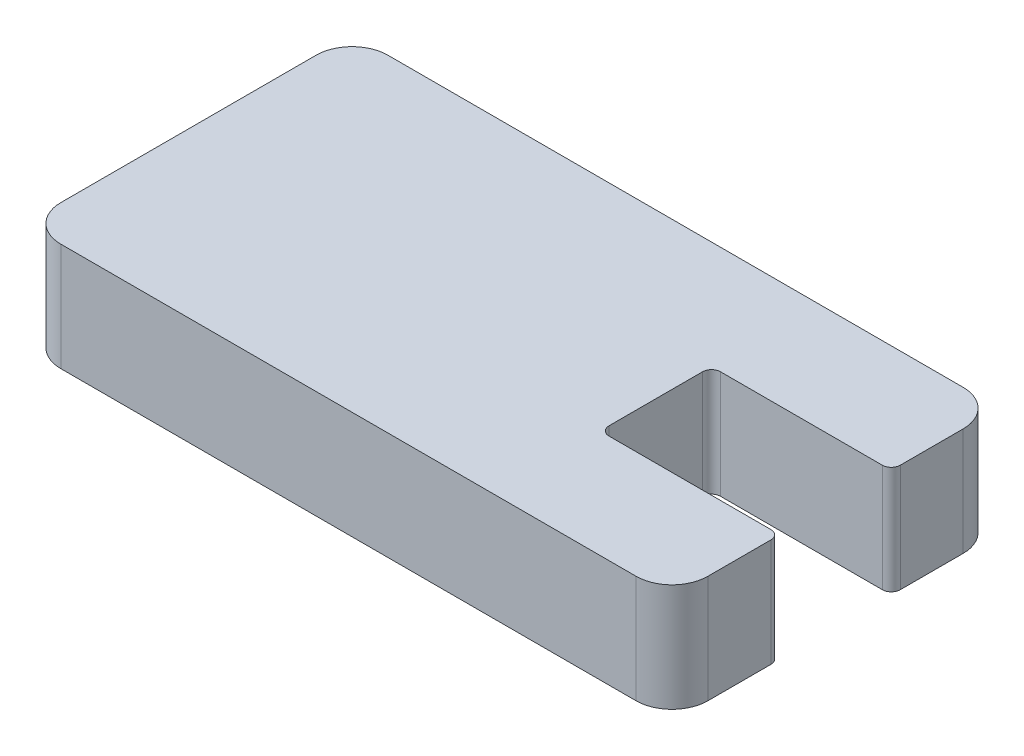
ISO-10303-21;
HEADER;
FILE_DESCRIPTION(('STEP AP214'),'2;1');
FILE_NAME('part.step','',(''),(''),'','','');
FILE_SCHEMA(('AUTOMOTIVE_DESIGN { 1 0 10303 214 1 1 1 1 }'));
ENDSEC;
DATA;
#1=APPLICATION_CONTEXT('core data for automotive mechanical design processes');
#2=APPLICATION_PROTOCOL_DEFINITION('international standard','automotive_design',2000,#1);
#3=PRODUCT_CONTEXT('',#1,'mechanical');
#4=PRODUCT('Part','Part','',(#3));
#5=PRODUCT_RELATED_PRODUCT_CATEGORY('part','',(#4));
#6=PRODUCT_DEFINITION_FORMATION('','',#4);
#7=PRODUCT_DEFINITION_CONTEXT('part definition',#1,'design');
#8=PRODUCT_DEFINITION('design','',#6,#7);
#9=PRODUCT_DEFINITION_SHAPE('','',#8);
#10=(LENGTH_UNIT() NAMED_UNIT(*) SI_UNIT(.MILLI.,.METRE.));
#11=(NAMED_UNIT(*) PLANE_ANGLE_UNIT() SI_UNIT($,.RADIAN.));
#12=(NAMED_UNIT(*) SI_UNIT($,.STERADIAN.) SOLID_ANGLE_UNIT());
#13=UNCERTAINTY_MEASURE_WITH_UNIT(LENGTH_MEASURE(1.E-05),#10,'distance_accuracy_value','');
#14=(GEOMETRIC_REPRESENTATION_CONTEXT(3) GLOBAL_UNCERTAINTY_ASSIGNED_CONTEXT((#13)) GLOBAL_UNIT_ASSIGNED_CONTEXT((#10,
#11,#12)) REPRESENTATION_CONTEXT('',''));
#15=CARTESIAN_POINT('',(0.,0.,0.));
#16=DIRECTION('',(0.,0.,1.));
#17=DIRECTION('',(1.,0.,0.));
#18=AXIS2_PLACEMENT_3D('',#15,#16,#17);
#19=CARTESIAN_POINT('',(17.,3.,-3.55));
#20=DIRECTION('',(0.,-1.,0.));
#21=DIRECTION('',(0.,0.,-1.));
#22=AXIS2_PLACEMENT_3D('',#19,#20,#21);
#23=CYLINDRICAL_SURFACE('',#22,0.999999999999998);
#24=CARTESIAN_POINT('',(17.,0.,-3.55));
#25=DIRECTION('',(0.,1.,0.));
#26=DIRECTION('',(0.,0.,1.));
#27=AXIS2_PLACEMENT_3D('',#24,#25,#26);
#28=CIRCLE('',#27,0.999999999999998);
#29=CARTESIAN_POINT('',(18.,0.,-3.55));
#30=VERTEX_POINT('',#29);
#31=CARTESIAN_POINT('',(17.,0.,-4.55));
#32=VERTEX_POINT('',#31);
#33=EDGE_CURVE('E169',#30,#32,#28,.T.);
#34=ORIENTED_EDGE('',*,*,#33,.T.);
#35=DIRECTION('',(0.,-1.,0.));
#36=VECTOR('',#35,1.);
#37=CARTESIAN_POINT('',(17.,3.,-4.55));
#38=LINE('',#37,#36);
#39=CARTESIAN_POINT('',(17.,3.,-4.55));
#40=VERTEX_POINT('',#39);
#41=EDGE_CURVE('E151',#40,#32,#38,.T.);
#42=ORIENTED_EDGE('',*,*,#41,.F.);
#43=CARTESIAN_POINT('',(17.,3.,-3.55));
#44=DIRECTION('',(0.,1.,0.));
#45=DIRECTION('',(0.,0.,1.));
#46=AXIS2_PLACEMENT_3D('',#43,#44,#45);
#47=CIRCLE('',#46,0.999999999999998);
#48=CARTESIAN_POINT('',(18.,3.,-3.55));
#49=VERTEX_POINT('',#48);
#50=EDGE_CURVE('E157',#49,#40,#47,.T.);
#51=ORIENTED_EDGE('',*,*,#50,.F.);
#52=DIRECTION('',(0.,-1.,0.));
#53=VECTOR('',#52,1.);
#54=CARTESIAN_POINT('',(18.,3.,-3.55));
#55=LINE('',#54,#53);
#56=EDGE_CURVE('E228',#49,#30,#55,.T.);
#57=ORIENTED_EDGE('',*,*,#56,.T.);
#58=EDGE_LOOP('',(#34,#42,#51,#57));
#59=FACE_BOUND('',#58,.T.);
#60=ADVANCED_FACE('F33',(#59),#23,.T.);
#61=CARTESIAN_POINT('',(17.,3.,-4.55));
#62=DIRECTION('',(0.,0.,1.));
#63=DIRECTION('',(1.,0.,0.));
#64=AXIS2_PLACEMENT_3D('',#61,#62,#63);
#65=PLANE('',#64);
#66=DIRECTION('',(-1.,0.,0.));
#67=VECTOR('',#66,1.);
#68=CARTESIAN_POINT('',(17.,0.,-4.55));
#69=LINE('',#68,#67);
#70=CARTESIAN_POINT('',(1.,0.,-4.55));
#71=VERTEX_POINT('',#70);
#72=EDGE_CURVE('E235',#32,#71,#69,.T.);
#73=ORIENTED_EDGE('',*,*,#72,.T.);
#74=DIRECTION('',(0.,-1.,0.));
#75=VECTOR('',#74,1.);
#76=CARTESIAN_POINT('',(1.,3.,-4.55));
#77=LINE('',#76,#75);
#78=CARTESIAN_POINT('',(1.,3.,-4.55));
#79=VERTEX_POINT('',#78);
#80=EDGE_CURVE('E154',#79,#71,#77,.T.);
#81=ORIENTED_EDGE('',*,*,#80,.F.);
#82=DIRECTION('',(-1.,0.,0.));
#83=VECTOR('',#82,1.);
#84=CARTESIAN_POINT('',(17.,3.,-4.55));
#85=LINE('',#84,#83);
#86=EDGE_CURVE('E147',#40,#79,#85,.T.);
#87=ORIENTED_EDGE('',*,*,#86,.F.);
#88=ORIENTED_EDGE('',*,*,#41,.T.);
#89=EDGE_LOOP('',(#73,#81,#87,#88));
#90=FACE_BOUND('',#89,.T.);
#91=ADVANCED_FACE('F149',(#90),#65,.F.);
#92=CARTESIAN_POINT('',(1.,3.,-3.55));
#93=DIRECTION('',(0.,-1.,0.));
#94=DIRECTION('',(0.,0.,-1.));
#95=AXIS2_PLACEMENT_3D('',#92,#93,#94);
#96=CYLINDRICAL_SURFACE('',#95,1.);
#97=CARTESIAN_POINT('',(1.,0.,-3.55));
#98=DIRECTION('',(0.,1.,0.));
#99=DIRECTION('',(0.,0.,-1.));
#100=AXIS2_PLACEMENT_3D('',#97,#98,#99);
#101=CIRCLE('',#100,1.);
#102=CARTESIAN_POINT('',(0.,0.,-3.54999999999999));
#103=VERTEX_POINT('',#102);
#104=EDGE_CURVE('E237',#71,#103,#101,.T.);
#105=ORIENTED_EDGE('',*,*,#104,.T.);
#106=DIRECTION('',(0.,-1.,0.));
#107=VECTOR('',#106,1.);
#108=CARTESIAN_POINT('',(0.,3.,-3.54999999999999));
#109=LINE('',#108,#107);
#110=CARTESIAN_POINT('',(0.,3.,-3.54999999999999));
#111=VERTEX_POINT('',#110);
#112=EDGE_CURVE('E174',#111,#103,#109,.T.);
#113=ORIENTED_EDGE('',*,*,#112,.F.);
#114=CARTESIAN_POINT('',(1.,3.,-3.55));
#115=DIRECTION('',(0.,1.,0.));
#116=DIRECTION('',(0.,0.,-1.));
#117=AXIS2_PLACEMENT_3D('',#114,#115,#116);
#118=CIRCLE('',#117,1.);
#119=EDGE_CURVE('E156',#79,#111,#118,.T.);
#120=ORIENTED_EDGE('',*,*,#119,.F.);
#121=ORIENTED_EDGE('',*,*,#80,.T.);
#122=EDGE_LOOP('',(#105,#113,#120,#121));
#123=FACE_BOUND('',#122,.T.);
#124=ADVANCED_FACE('F331',(#123),#96,.T.);
#125=CARTESIAN_POINT('',(0.,3.,-3.54999999999999));
#126=DIRECTION('',(1.,0.,0.));
#127=DIRECTION('',(0.,0.,-1.));
#128=AXIS2_PLACEMENT_3D('',#125,#126,#127);
#129=PLANE('',#128);
#130=DIRECTION('',(0.,0.,1.));
#131=VECTOR('',#130,1.);
#132=CARTESIAN_POINT('',(0.,0.,-3.54999999999999));
#133=LINE('',#132,#131);
#134=CARTESIAN_POINT('',(0.,0.,3.54999999999999));
#135=VERTEX_POINT('',#134);
#136=EDGE_CURVE('E239',#103,#135,#133,.T.);
#137=ORIENTED_EDGE('',*,*,#136,.T.);
#138=DIRECTION('',(0.,-1.,0.));
#139=VECTOR('',#138,1.);
#140=CARTESIAN_POINT('',(0.,3.,3.54999999999999));
#141=LINE('',#140,#139);
#142=CARTESIAN_POINT('',(0.,3.,3.54999999999999));
#143=VERTEX_POINT('',#142);
#144=EDGE_CURVE('E264',#143,#135,#141,.T.);
#145=ORIENTED_EDGE('',*,*,#144,.F.);
#146=DIRECTION('',(0.,0.,1.));
#147=VECTOR('',#146,1.);
#148=CARTESIAN_POINT('',(0.,3.,-3.54999999999999));
#149=LINE('',#148,#147);
#150=EDGE_CURVE('E273',#111,#143,#149,.T.);
#151=ORIENTED_EDGE('',*,*,#150,.F.);
#152=ORIENTED_EDGE('',*,*,#112,.T.);
#153=EDGE_LOOP('',(#137,#145,#151,#152));
#154=FACE_BOUND('',#153,.T.);
#155=ADVANCED_FACE('F271',(#154),#129,.F.);
#156=CARTESIAN_POINT('',(1.,3.,3.55));
#157=DIRECTION('',(0.,-1.,0.));
#158=DIRECTION('',(0.,0.,-1.));
#159=AXIS2_PLACEMENT_3D('',#156,#157,#158);
#160=CYLINDRICAL_SURFACE('',#159,1.);
#161=CARTESIAN_POINT('',(1.,0.,3.55));
#162=DIRECTION('',(0.,1.,0.));
#163=DIRECTION('',(0.,0.,1.));
#164=AXIS2_PLACEMENT_3D('',#161,#162,#163);
#165=CIRCLE('',#164,1.);
#166=CARTESIAN_POINT('',(1.00000000000001,0.,4.55));
#167=VERTEX_POINT('',#166);
#168=EDGE_CURVE('E241',#135,#167,#165,.T.);
#169=ORIENTED_EDGE('',*,*,#168,.T.);
#170=DIRECTION('',(0.,-1.,0.));
#171=VECTOR('',#170,1.);
#172=CARTESIAN_POINT('',(1.00000000000001,3.,4.55));
#173=LINE('',#172,#171);
#174=CARTESIAN_POINT('',(1.00000000000001,3.,4.55));
#175=VERTEX_POINT('',#174);
#176=EDGE_CURVE('E261',#175,#167,#173,.T.);
#177=ORIENTED_EDGE('',*,*,#176,.F.);
#178=CARTESIAN_POINT('',(1.,3.,3.55));
#179=DIRECTION('',(0.,1.,0.));
#180=DIRECTION('',(0.,0.,1.));
#181=AXIS2_PLACEMENT_3D('',#178,#179,#180);
#182=CIRCLE('',#181,1.);
#183=EDGE_CURVE('E290',#143,#175,#182,.T.);
#184=ORIENTED_EDGE('',*,*,#183,.F.);
#185=ORIENTED_EDGE('',*,*,#144,.T.);
#186=EDGE_LOOP('',(#169,#177,#184,#185));
#187=FACE_BOUND('',#186,.T.);
#188=ADVANCED_FACE('F281',(#187),#160,.T.);
#189=CARTESIAN_POINT('',(1.00000000000001,3.,4.55));
#190=DIRECTION('',(0.,0.,-1.));
#191=DIRECTION('',(-1.,0.,0.));
#192=AXIS2_PLACEMENT_3D('',#189,#190,#191);
#193=PLANE('',#192);
#194=DIRECTION('',(1.,0.,0.));
#195=VECTOR('',#194,1.);
#196=CARTESIAN_POINT('',(1.00000000000001,0.,4.55));
#197=LINE('',#196,#195);
#198=CARTESIAN_POINT('',(17.,0.,4.55));
#199=VERTEX_POINT('',#198);
#200=EDGE_CURVE('E243',#167,#199,#197,.T.);
#201=ORIENTED_EDGE('',*,*,#200,.T.);
#202=DIRECTION('',(0.,-1.,0.));
#203=VECTOR('',#202,1.);
#204=CARTESIAN_POINT('',(17.,3.,4.55));
#205=LINE('',#204,#203);
#206=CARTESIAN_POINT('',(17.,3.,4.55));
#207=VERTEX_POINT('',#206);
#208=EDGE_CURVE('E258',#207,#199,#205,.T.);
#209=ORIENTED_EDGE('',*,*,#208,.F.);
#210=DIRECTION('',(1.,0.,0.));
#211=VECTOR('',#210,1.);
#212=CARTESIAN_POINT('',(1.00000000000001,3.,4.55));
#213=LINE('',#212,#211);
#214=EDGE_CURVE('E287',#175,#207,#213,.T.);
#215=ORIENTED_EDGE('',*,*,#214,.F.);
#216=ORIENTED_EDGE('',*,*,#176,.T.);
#217=EDGE_LOOP('',(#201,#209,#215,#216));
#218=FACE_BOUND('',#217,.T.);
#219=ADVANCED_FACE('F285',(#218),#193,.F.);
#220=CARTESIAN_POINT('',(17.,3.,3.55));
#221=DIRECTION('',(0.,-1.,0.));
#222=DIRECTION('',(0.,0.,-1.));
#223=AXIS2_PLACEMENT_3D('',#220,#221,#222);
#224=CYLINDRICAL_SURFACE('',#223,1.);
#225=CARTESIAN_POINT('',(17.,0.,3.55));
#226=DIRECTION('',(0.,1.,0.));
#227=DIRECTION('',(0.,0.,1.));
#228=AXIS2_PLACEMENT_3D('',#225,#226,#227);
#229=CIRCLE('',#228,1.);
#230=CARTESIAN_POINT('',(18.,0.,3.55));
#231=VERTEX_POINT('',#230);
#232=EDGE_CURVE('E245',#199,#231,#229,.T.);
#233=ORIENTED_EDGE('',*,*,#232,.T.);
#234=DIRECTION('',(0.,-1.,0.));
#235=VECTOR('',#234,1.);
#236=CARTESIAN_POINT('',(18.,3.,3.55));
#237=LINE('',#236,#235);
#238=CARTESIAN_POINT('',(18.,3.,3.55));
#239=VERTEX_POINT('',#238);
#240=EDGE_CURVE('E255',#239,#231,#237,.T.);
#241=ORIENTED_EDGE('',*,*,#240,.F.);
#242=CARTESIAN_POINT('',(17.,3.,3.55));
#243=DIRECTION('',(0.,1.,0.));
#244=DIRECTION('',(0.,0.,1.));
#245=AXIS2_PLACEMENT_3D('',#242,#243,#244);
#246=CIRCLE('',#245,1.);
#247=EDGE_CURVE('E289',#207,#239,#246,.T.);
#248=ORIENTED_EDGE('',*,*,#247,.F.);
#249=ORIENTED_EDGE('',*,*,#208,.T.);
#250=EDGE_LOOP('',(#233,#241,#248,#249));
#251=FACE_BOUND('',#250,.T.);
#252=ADVANCED_FACE('F316',(#251),#224,.T.);
#253=CARTESIAN_POINT('',(18.,3.,3.55));
#254=DIRECTION('',(-1.,0.,0.));
#255=DIRECTION('',(0.,0.,1.));
#256=AXIS2_PLACEMENT_3D('',#253,#254,#255);
#257=PLANE('',#256);
#258=DIRECTION('',(0.,0.,-1.));
#259=VECTOR('',#258,1.);
#260=CARTESIAN_POINT('',(18.,0.,3.55));
#261=LINE('',#260,#259);
#262=CARTESIAN_POINT('',(18.,0.,1.8));
#263=VERTEX_POINT('',#262);
#264=EDGE_CURVE('E247',#231,#263,#261,.T.);
#265=ORIENTED_EDGE('',*,*,#264,.T.);
#266=DIRECTION('',(0.,-1.,0.));
#267=VECTOR('',#266,1.);
#268=CARTESIAN_POINT('',(18.,3.,1.8));
#269=LINE('',#268,#267);
#270=CARTESIAN_POINT('',(18.,3.,1.8));
#271=VERTEX_POINT('',#270);
#272=EDGE_CURVE('E184',#263,#271,#269,.F.);
#273=ORIENTED_EDGE('',*,*,#272,.T.);
#274=DIRECTION('',(0.,0.,-1.));
#275=VECTOR('',#274,1.);
#276=CARTESIAN_POINT('',(18.,3.,3.55));
#277=LINE('',#276,#275);
#278=EDGE_CURVE('E292',#239,#271,#277,.T.);
#279=ORIENTED_EDGE('',*,*,#278,.F.);
#280=ORIENTED_EDGE('',*,*,#240,.T.);
#281=EDGE_LOOP('',(#265,#273,#279,#280));
#282=FACE_BOUND('',#281,.T.);
#283=ADVANCED_FACE('F312',(#282),#257,.F.);
#284=CARTESIAN_POINT('',(18.,3.,1.55));
#285=DIRECTION('',(0.,0.,1.));
#286=DIRECTION('',(1.,0.,0.));
#287=AXIS2_PLACEMENT_3D('',#284,#285,#286);
#288=PLANE('',#287);
#289=DIRECTION('',(-1.,0.,0.));
#290=VECTOR('',#289,1.);
#291=CARTESIAN_POINT('',(18.,3.,1.55));
#292=LINE('',#291,#290);
#293=CARTESIAN_POINT('',(17.75,3.,1.55));
#294=VERTEX_POINT('',#293);
#295=CARTESIAN_POINT('',(13.25,3.,1.55));
#296=VERTEX_POINT('',#295);
#297=EDGE_CURVE('E230',#294,#296,#292,.T.);
#298=ORIENTED_EDGE('',*,*,#297,.F.);
#299=DIRECTION('',(0.,-1.,0.));
#300=VECTOR('',#299,1.);
#301=CARTESIAN_POINT('',(17.75,3.,1.55));
#302=LINE('',#301,#300);
#303=CARTESIAN_POINT('',(17.75,0.,1.55));
#304=VERTEX_POINT('',#303);
#305=EDGE_CURVE('E172',#294,#304,#302,.T.);
#306=ORIENTED_EDGE('',*,*,#305,.T.);
#307=DIRECTION('',(-1.,0.,0.));
#308=VECTOR('',#307,1.);
#309=CARTESIAN_POINT('',(18.,0.,1.55));
#310=LINE('',#309,#308);
#311=CARTESIAN_POINT('',(13.25,0.,1.55));
#312=VERTEX_POINT('',#311);
#313=EDGE_CURVE('E220',#304,#312,#310,.T.);
#314=ORIENTED_EDGE('',*,*,#313,.T.);
#315=DIRECTION('',(0.,-1.,0.));
#316=VECTOR('',#315,1.);
#317=CARTESIAN_POINT('',(13.25,3.,1.55));
#318=LINE('',#317,#316);
#319=EDGE_CURVE('E170',#312,#296,#318,.F.);
#320=ORIENTED_EDGE('',*,*,#319,.T.);
#321=EDGE_LOOP('',(#298,#306,#314,#320));
#322=FACE_BOUND('',#321,.T.);
#323=ADVANCED_FACE('F306',(#322),#288,.F.);
#324=CARTESIAN_POINT('',(13.,3.,1.55));
#325=DIRECTION('',(-1.,0.,0.));
#326=DIRECTION('',(0.,0.,1.));
#327=AXIS2_PLACEMENT_3D('',#324,#325,#326);
#328=PLANE('',#327);
#329=DIRECTION('',(0.,0.,-1.));
#330=VECTOR('',#329,1.);
#331=CARTESIAN_POINT('',(13.,3.,1.55));
#332=LINE('',#331,#330);
#333=CARTESIAN_POINT('',(13.,3.,1.3));
#334=VERTEX_POINT('',#333);
#335=CARTESIAN_POINT('',(13.,3.,-1.3));
#336=VERTEX_POINT('',#335);
#337=EDGE_CURVE('E225',#334,#336,#332,.T.);
#338=ORIENTED_EDGE('',*,*,#337,.F.);
#339=DIRECTION('',(0.,-1.,0.));
#340=VECTOR('',#339,1.);
#341=CARTESIAN_POINT('',(13.,0.,1.3));
#342=LINE('',#341,#340);
#343=CARTESIAN_POINT('',(13.,0.,1.3));
#344=VERTEX_POINT('',#343);
#345=EDGE_CURVE('E191',#334,#344,#342,.T.);
#346=ORIENTED_EDGE('',*,*,#345,.T.);
#347=DIRECTION('',(0.,0.,-1.));
#348=VECTOR('',#347,1.);
#349=CARTESIAN_POINT('',(13.,0.,1.55));
#350=LINE('',#349,#348);
#351=CARTESIAN_POINT('',(13.,0.,-1.3));
#352=VERTEX_POINT('',#351);
#353=EDGE_CURVE('E210',#344,#352,#350,.T.);
#354=ORIENTED_EDGE('',*,*,#353,.T.);
#355=DIRECTION('',(0.,-1.,0.));
#356=VECTOR('',#355,1.);
#357=CARTESIAN_POINT('',(13.,3.,-1.3));
#358=LINE('',#357,#356);
#359=EDGE_CURVE('E189',#352,#336,#358,.F.);
#360=ORIENTED_EDGE('',*,*,#359,.T.);
#361=EDGE_LOOP('',(#338,#346,#354,#360));
#362=FACE_BOUND('',#361,.T.);
#363=ADVANCED_FACE('F217',(#362),#328,.F.);
#364=CARTESIAN_POINT('',(13.,3.,-1.55));
#365=DIRECTION('',(0.,0.,-1.));
#366=DIRECTION('',(-1.,0.,0.));
#367=AXIS2_PLACEMENT_3D('',#364,#365,#366);
#368=PLANE('',#367);
#369=DIRECTION('',(1.,0.,0.));
#370=VECTOR('',#369,1.);
#371=CARTESIAN_POINT('',(13.,3.,-1.55));
#372=LINE('',#371,#370);
#373=CARTESIAN_POINT('',(13.25,3.,-1.55));
#374=VERTEX_POINT('',#373);
#375=CARTESIAN_POINT('',(17.75,3.,-1.55));
#376=VERTEX_POINT('',#375);
#377=EDGE_CURVE('E224',#374,#376,#372,.T.);
#378=ORIENTED_EDGE('',*,*,#377,.F.);
#379=DIRECTION('',(0.,-1.,0.));
#380=VECTOR('',#379,1.);
#381=CARTESIAN_POINT('',(13.25,0.,-1.55));
#382=LINE('',#381,#380);
#383=CARTESIAN_POINT('',(13.25,0.,-1.55));
#384=VERTEX_POINT('',#383);
#385=EDGE_CURVE('E195',#374,#384,#382,.T.);
#386=ORIENTED_EDGE('',*,*,#385,.T.);
#387=DIRECTION('',(1.,0.,0.));
#388=VECTOR('',#387,1.);
#389=CARTESIAN_POINT('',(13.,0.,-1.55));
#390=LINE('',#389,#388);
#391=CARTESIAN_POINT('',(17.75,0.,-1.55));
#392=VERTEX_POINT('',#391);
#393=EDGE_CURVE('E211',#384,#392,#390,.T.);
#394=ORIENTED_EDGE('',*,*,#393,.T.);
#395=DIRECTION('',(0.,-1.,0.));
#396=VECTOR('',#395,1.);
#397=CARTESIAN_POINT('',(17.75,3.,-1.55));
#398=LINE('',#397,#396);
#399=EDGE_CURVE('E56',#392,#376,#398,.F.);
#400=ORIENTED_EDGE('',*,*,#399,.T.);
#401=EDGE_LOOP('',(#378,#386,#394,#400));
#402=FACE_BOUND('',#401,.T.);
#403=ADVANCED_FACE('F226',(#402),#368,.F.);
#404=CARTESIAN_POINT('',(18.,3.,-1.55));
#405=DIRECTION('',(-1.,0.,0.));
#406=DIRECTION('',(0.,0.,1.));
#407=AXIS2_PLACEMENT_3D('',#404,#405,#406);
#408=PLANE('',#407);
#409=DIRECTION('',(0.,0.,-1.));
#410=VECTOR('',#409,1.);
#411=CARTESIAN_POINT('',(18.,3.,-1.55));
#412=LINE('',#411,#410);
#413=CARTESIAN_POINT('',(18.,3.,-1.8));
#414=VERTEX_POINT('',#413);
#415=EDGE_CURVE('E162',#414,#49,#412,.T.);
#416=ORIENTED_EDGE('',*,*,#415,.F.);
#417=DIRECTION('',(0.,-1.,0.));
#418=VECTOR('',#417,1.);
#419=CARTESIAN_POINT('',(18.,3.,-1.8));
#420=LINE('',#419,#418);
#421=CARTESIAN_POINT('',(18.,0.,-1.8));
#422=VERTEX_POINT('',#421);
#423=EDGE_CURVE('E198',#414,#422,#420,.T.);
#424=ORIENTED_EDGE('',*,*,#423,.T.);
#425=DIRECTION('',(0.,0.,-1.));
#426=VECTOR('',#425,1.);
#427=CARTESIAN_POINT('',(18.,0.,-1.55));
#428=LINE('',#427,#426);
#429=EDGE_CURVE('E166',#422,#30,#428,.T.);
#430=ORIENTED_EDGE('',*,*,#429,.T.);
#431=ORIENTED_EDGE('',*,*,#56,.F.);
#432=EDGE_LOOP('',(#416,#424,#430,#431));
#433=FACE_BOUND('',#432,.T.);
#434=ADVANCED_FACE('F348',(#433),#408,.F.);
#435=CARTESIAN_POINT('',(17.,3.,-3.55));
#436=DIRECTION('',(0.,1.,0.));
#437=DIRECTION('',(0.,0.,1.));
#438=AXIS2_PLACEMENT_3D('',#435,#436,#437);
#439=PLANE('',#438);
#440=ORIENTED_EDGE('',*,*,#278,.T.);
#441=CARTESIAN_POINT('',(17.75,3.,1.8));
#442=DIRECTION('',(0.,1.,0.));
#443=DIRECTION('',(0.,0.,1.));
#444=AXIS2_PLACEMENT_3D('',#441,#442,#443);
#445=CIRCLE('',#444,0.25);
#446=EDGE_CURVE('E187',#271,#294,#445,.T.);
#447=ORIENTED_EDGE('',*,*,#446,.T.);
#448=ORIENTED_EDGE('',*,*,#297,.T.);
#449=CARTESIAN_POINT('',(13.25,3.,1.3));
#450=DIRECTION('',(0.,1.,0.));
#451=DIRECTION('',(0.,0.,1.));
#452=AXIS2_PLACEMENT_3D('',#449,#450,#451);
#453=CIRCLE('',#452,0.25);
#454=EDGE_CURVE('E203',#296,#334,#453,.F.);
#455=ORIENTED_EDGE('',*,*,#454,.T.);
#456=ORIENTED_EDGE('',*,*,#337,.T.);
#457=CARTESIAN_POINT('',(13.25,3.,-1.3));
#458=DIRECTION('',(0.,1.,0.));
#459=DIRECTION('',(0.,0.,1.));
#460=AXIS2_PLACEMENT_3D('',#457,#458,#459);
#461=CIRCLE('',#460,0.25);
#462=EDGE_CURVE('E11',#336,#374,#461,.F.);
#463=ORIENTED_EDGE('',*,*,#462,.T.);
#464=ORIENTED_EDGE('',*,*,#377,.T.);
#465=CARTESIAN_POINT('',(17.75,3.,-1.8));
#466=DIRECTION('',(0.,1.,0.));
#467=DIRECTION('',(0.,0.,1.));
#468=AXIS2_PLACEMENT_3D('',#465,#466,#467);
#469=CIRCLE('',#468,0.25);
#470=EDGE_CURVE('E48',#376,#414,#469,.T.);
#471=ORIENTED_EDGE('',*,*,#470,.T.);
#472=ORIENTED_EDGE('',*,*,#415,.T.);
#473=ORIENTED_EDGE('',*,*,#50,.T.);
#474=ORIENTED_EDGE('',*,*,#86,.T.);
#475=ORIENTED_EDGE('',*,*,#119,.T.);
#476=ORIENTED_EDGE('',*,*,#150,.T.);
#477=ORIENTED_EDGE('',*,*,#183,.T.);
#478=ORIENTED_EDGE('',*,*,#214,.T.);
#479=ORIENTED_EDGE('',*,*,#247,.T.);
#480=EDGE_LOOP('',(#440,#447,#448,#455,#456,#463,#464,#471,#472,#473,#474,#475,#476,#477,#478,#479));
#481=FACE_BOUND('',#480,.T.);
#482=ADVANCED_FACE('F161',(#481),#439,.T.);
#483=CARTESIAN_POINT('',(17.,0.,-3.55));
#484=DIRECTION('',(0.,1.,0.));
#485=DIRECTION('',(0.,0.,1.));
#486=AXIS2_PLACEMENT_3D('',#483,#484,#485);
#487=PLANE('',#486);
#488=ORIENTED_EDGE('',*,*,#313,.F.);
#489=CARTESIAN_POINT('',(17.75,0.,1.8));
#490=DIRECTION('',(0.,1.,0.));
#491=DIRECTION('',(0.,0.,1.));
#492=AXIS2_PLACEMENT_3D('',#489,#490,#491);
#493=CIRCLE('',#492,0.25);
#494=EDGE_CURVE('E182',#304,#263,#493,.F.);
#495=ORIENTED_EDGE('',*,*,#494,.T.);
#496=ORIENTED_EDGE('',*,*,#264,.F.);
#497=ORIENTED_EDGE('',*,*,#232,.F.);
#498=ORIENTED_EDGE('',*,*,#200,.F.);
#499=ORIENTED_EDGE('',*,*,#168,.F.);
#500=ORIENTED_EDGE('',*,*,#136,.F.);
#501=ORIENTED_EDGE('',*,*,#104,.F.);
#502=ORIENTED_EDGE('',*,*,#72,.F.);
#503=ORIENTED_EDGE('',*,*,#33,.F.);
#504=ORIENTED_EDGE('',*,*,#429,.F.);
#505=CARTESIAN_POINT('',(17.75,0.,-1.8));
#506=DIRECTION('',(0.,1.,0.));
#507=DIRECTION('',(0.,0.,1.));
#508=AXIS2_PLACEMENT_3D('',#505,#506,#507);
#509=CIRCLE('',#508,0.25);
#510=EDGE_CURVE('E180',#422,#392,#509,.F.);
#511=ORIENTED_EDGE('',*,*,#510,.T.);
#512=ORIENTED_EDGE('',*,*,#393,.F.);
#513=CARTESIAN_POINT('',(13.25,0.,-1.3));
#514=DIRECTION('',(0.,1.,0.));
#515=DIRECTION('',(0.,0.,1.));
#516=AXIS2_PLACEMENT_3D('',#513,#514,#515);
#517=CIRCLE('',#516,0.25);
#518=EDGE_CURVE('E41',#384,#352,#517,.T.);
#519=ORIENTED_EDGE('',*,*,#518,.T.);
#520=ORIENTED_EDGE('',*,*,#353,.F.);
#521=CARTESIAN_POINT('',(13.25,0.,1.3));
#522=DIRECTION('',(0.,1.,0.));
#523=DIRECTION('',(0.,0.,1.));
#524=AXIS2_PLACEMENT_3D('',#521,#522,#523);
#525=CIRCLE('',#524,0.25);
#526=EDGE_CURVE('E201',#344,#312,#525,.T.);
#527=ORIENTED_EDGE('',*,*,#526,.T.);
#528=EDGE_LOOP('',(#488,#495,#496,#497,#498,#499,#500,#501,#502,#503,#504,#511,#512,#519,#520,#527));
#529=FACE_BOUND('',#528,.T.);
#530=ADVANCED_FACE('F209',(#529),#487,.F.);
#531=CARTESIAN_POINT('',(17.75,3.,1.8));
#532=DIRECTION('',(0.,-1.,0.));
#533=DIRECTION('',(0.,0.,-1.));
#534=AXIS2_PLACEMENT_3D('',#531,#532,#533);
#535=CYLINDRICAL_SURFACE('',#534,0.25);
#536=ORIENTED_EDGE('',*,*,#446,.F.);
#537=ORIENTED_EDGE('',*,*,#272,.F.);
#538=ORIENTED_EDGE('',*,*,#494,.F.);
#539=ORIENTED_EDGE('',*,*,#305,.F.);
#540=EDGE_LOOP('',(#536,#537,#538,#539));
#541=FACE_BOUND('',#540,.T.);
#542=ADVANCED_FACE('F308',(#541),#535,.T.);
#543=CARTESIAN_POINT('',(13.25,3.,1.3));
#544=DIRECTION('',(0.,1.,0.));
#545=DIRECTION('',(0.,0.,1.));
#546=AXIS2_PLACEMENT_3D('',#543,#544,#545);
#547=CYLINDRICAL_SURFACE('',#546,0.25);
#548=ORIENTED_EDGE('',*,*,#454,.F.);
#549=ORIENTED_EDGE('',*,*,#319,.F.);
#550=ORIENTED_EDGE('',*,*,#526,.F.);
#551=ORIENTED_EDGE('',*,*,#345,.F.);
#552=EDGE_LOOP('',(#548,#549,#550,#551));
#553=FACE_BOUND('',#552,.T.);
#554=ADVANCED_FACE('F305',(#553),#547,.F.);
#555=CARTESIAN_POINT('',(13.25,3.,-1.3));
#556=DIRECTION('',(0.,1.,0.));
#557=DIRECTION('',(0.,0.,1.));
#558=AXIS2_PLACEMENT_3D('',#555,#556,#557);
#559=CYLINDRICAL_SURFACE('',#558,0.25);
#560=ORIENTED_EDGE('',*,*,#462,.F.);
#561=ORIENTED_EDGE('',*,*,#359,.F.);
#562=ORIENTED_EDGE('',*,*,#518,.F.);
#563=ORIENTED_EDGE('',*,*,#385,.F.);
#564=EDGE_LOOP('',(#560,#561,#562,#563));
#565=FACE_BOUND('',#564,.T.);
#566=ADVANCED_FACE('F223',(#565),#559,.F.);
#567=CARTESIAN_POINT('',(17.75,3.,-1.8));
#568=DIRECTION('',(0.,-1.,0.));
#569=DIRECTION('',(0.,0.,-1.));
#570=AXIS2_PLACEMENT_3D('',#567,#568,#569);
#571=CYLINDRICAL_SURFACE('',#570,0.25);
#572=ORIENTED_EDGE('',*,*,#470,.F.);
#573=ORIENTED_EDGE('',*,*,#399,.F.);
#574=ORIENTED_EDGE('',*,*,#510,.F.);
#575=ORIENTED_EDGE('',*,*,#423,.F.);
#576=EDGE_LOOP('',(#572,#573,#574,#575));
#577=FACE_BOUND('',#576,.T.);
#578=ADVANCED_FACE('F35',(#577),#571,.T.);
#579=CLOSED_SHELL('',(#60,#91,#124,#155,#188,#219,#252,#283,#323,#363,#403,#434,#482,#530,#542,
#554,#566,#578));
#580=MANIFOLD_SOLID_BREP('B2',#579);
#581=ADVANCED_BREP_SHAPE_REPRESENTATION('',(#18,#580),#14);
#582=SHAPE_DEFINITION_REPRESENTATION(#9,#581);
ENDSEC;
END-ISO-10303-21;
